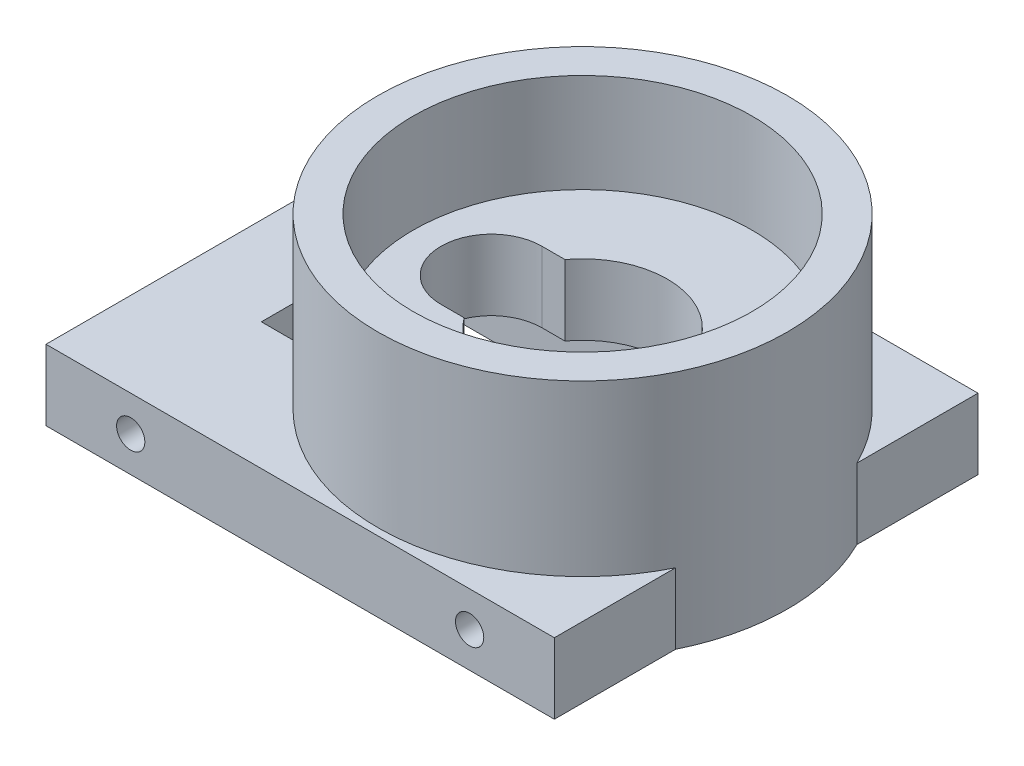
ISO-10303-21;
HEADER;
FILE_DESCRIPTION(('STEP AP214'),'2;1');
FILE_NAME('part.step','',(''),(''),'','','');
FILE_SCHEMA(('AUTOMOTIVE_DESIGN { 1 0 10303 214 1 1 1 1 }'));
ENDSEC;
DATA;
#1=APPLICATION_CONTEXT('core data for automotive mechanical design processes');
#2=APPLICATION_PROTOCOL_DEFINITION('international standard','automotive_design',2000,#1);
#3=PRODUCT_CONTEXT('',#1,'mechanical');
#4=PRODUCT('Part','Part','',(#3));
#5=PRODUCT_RELATED_PRODUCT_CATEGORY('part','',(#4));
#6=PRODUCT_DEFINITION_FORMATION('','',#4);
#7=PRODUCT_DEFINITION_CONTEXT('part definition',#1,'design');
#8=PRODUCT_DEFINITION('design','',#6,#7);
#9=PRODUCT_DEFINITION_SHAPE('','',#8);
#10=(LENGTH_UNIT() NAMED_UNIT(*) SI_UNIT(.MILLI.,.METRE.));
#11=(NAMED_UNIT(*) PLANE_ANGLE_UNIT() SI_UNIT($,.RADIAN.));
#12=(NAMED_UNIT(*) SI_UNIT($,.STERADIAN.) SOLID_ANGLE_UNIT());
#13=UNCERTAINTY_MEASURE_WITH_UNIT(LENGTH_MEASURE(1.E-05),#10,'distance_accuracy_value','');
#14=(GEOMETRIC_REPRESENTATION_CONTEXT(3) GLOBAL_UNCERTAINTY_ASSIGNED_CONTEXT((#13)) GLOBAL_UNIT_ASSIGNED_CONTEXT((#10,
#11,#12)) REPRESENTATION_CONTEXT('',''));
#15=CARTESIAN_POINT('',(0.,0.,0.));
#16=DIRECTION('',(0.,0.,1.));
#17=DIRECTION('',(1.,0.,0.));
#18=AXIS2_PLACEMENT_3D('',#15,#16,#17);
#19=CARTESIAN_POINT('',(0.,5.,0.));
#20=DIRECTION('',(0.,1.,0.));
#21=DIRECTION('',(0.,0.,1.));
#22=AXIS2_PLACEMENT_3D('',#19,#20,#21);
#23=PLANE('',#22);
#24=DIRECTION('',(-1.,0.,0.));
#25=VECTOR('',#24,1.);
#26=CARTESIAN_POINT('',(-11.75,5.,6.));
#27=LINE('',#26,#25);
#28=CARTESIAN_POINT('',(11.75,5.,6.));
#29=VERTEX_POINT('',#28);
#30=CARTESIAN_POINT('',(5.,5.,6.));
#31=VERTEX_POINT('',#30);
#32=EDGE_CURVE('E215',#29,#31,#27,.T.);
#33=ORIENTED_EDGE('',*,*,#32,.T.);
#34=CARTESIAN_POINT('',(5.,5.,0.));
#35=DIRECTION('',(0.,1.,0.));
#36=DIRECTION('',(0.,0.,1.));
#37=AXIS2_PLACEMENT_3D('',#34,#35,#36);
#38=CIRCLE('',#37,6.);
#39=CARTESIAN_POINT('',(5.,5.,-6.));
#40=VERTEX_POINT('',#39);
#41=EDGE_CURVE('E59',#40,#31,#38,.F.);
#42=ORIENTED_EDGE('',*,*,#41,.F.);
#43=DIRECTION('',(1.,0.,0.));
#44=VECTOR('',#43,1.);
#45=CARTESIAN_POINT('',(-11.75,5.,-6.));
#46=LINE('',#45,#44);
#47=CARTESIAN_POINT('',(11.75,5.,-6.));
#48=VERTEX_POINT('',#47);
#49=EDGE_CURVE('E229',#40,#48,#46,.T.);
#50=ORIENTED_EDGE('',*,*,#49,.T.);
#51=DIRECTION('',(0.,0.,1.));
#52=VECTOR('',#51,1.);
#53=CARTESIAN_POINT('',(11.75,5.,-6.));
#54=LINE('',#53,#52);
#55=EDGE_CURVE('E220',#48,#29,#54,.T.);
#56=ORIENTED_EDGE('',*,*,#55,.T.);
#57=EDGE_LOOP('',(#33,#42,#50,#56));
#58=FACE_BOUND('',#57,.T.);
#59=ADVANCED_FACE('F36',(#58),#23,.F.);
#60=CARTESIAN_POINT('',(0.,2.,0.));
#61=DIRECTION('',(0.,-1.,0.));
#62=DIRECTION('',(0.,0.,-1.));
#63=AXIS2_PLACEMENT_3D('',#60,#61,#62);
#64=PLANE('',#63);
#65=DIRECTION('',(0.,0.,-1.));
#66=VECTOR('',#65,1.);
#67=CARTESIAN_POINT('',(-11.75,2.,0.));
#68=LINE('',#67,#66);
#69=CARTESIAN_POINT('',(-11.75,2.,6.));
#70=VERTEX_POINT('',#69);
#71=CARTESIAN_POINT('',(-11.75,2.,-6.));
#72=VERTEX_POINT('',#71);
#73=EDGE_CURVE('E335',#70,#72,#68,.T.);
#74=ORIENTED_EDGE('',*,*,#73,.F.);
#75=DIRECTION('',(-1.,0.,0.));
#76=VECTOR('',#75,1.);
#77=CARTESIAN_POINT('',(-16.5,2.,6.));
#78=LINE('',#77,#76);
#79=CARTESIAN_POINT('',(-16.5,2.,6.));
#80=VERTEX_POINT('',#79);
#81=EDGE_CURVE('E256',#70,#80,#78,.T.);
#82=ORIENTED_EDGE('',*,*,#81,.T.);
#83=DIRECTION('',(0.,0.,-1.));
#84=VECTOR('',#83,1.);
#85=CARTESIAN_POINT('',(-16.5,2.,6.));
#86=LINE('',#85,#84);
#87=CARTESIAN_POINT('',(-16.5,2.,-6.));
#88=VERTEX_POINT('',#87);
#89=EDGE_CURVE('E261',#80,#88,#86,.T.);
#90=ORIENTED_EDGE('',*,*,#89,.T.);
#91=DIRECTION('',(1.,0.,0.));
#92=VECTOR('',#91,1.);
#93=CARTESIAN_POINT('',(-16.5,2.,-6.));
#94=LINE('',#93,#92);
#95=EDGE_CURVE('E265',#88,#72,#94,.T.);
#96=ORIENTED_EDGE('',*,*,#95,.T.);
#97=EDGE_LOOP('',(#74,#82,#90,#96));
#98=FACE_BOUND('',#97,.T.);
#99=CARTESIAN_POINT('',(-14.,2.,0.));
#100=DIRECTION('',(0.,-1.,0.));
#101=DIRECTION('',(0.,0.,-1.));
#102=AXIS2_PLACEMENT_3D('',#99,#100,#101);
#103=CIRCLE('',#102,1.);
#104=CARTESIAN_POINT('',(-14.,2.,-1.));
#105=VERTEX_POINT('',#104);
#106=EDGE_CURVE('E240',#105,#105,#103,.T.);
#107=ORIENTED_EDGE('',*,*,#106,.F.);
#108=EDGE_LOOP('',(#107));
#109=FACE_BOUND('',#108,.T.);
#110=ADVANCED_FACE('F380',(#98,#109),#64,.T.);
#111=CARTESIAN_POINT('',(18.,5.,-15.));
#112=DIRECTION('',(-1.,0.,0.));
#113=DIRECTION('',(0.,0.,1.));
#114=AXIS2_PLACEMENT_3D('',#111,#112,#113);
#115=PLANE('',#114);
#116=DIRECTION('',(0.,0.,-1.));
#117=VECTOR('',#116,1.);
#118=CARTESIAN_POINT('',(18.,5.,-15.));
#119=LINE('',#118,#117);
#120=CARTESIAN_POINT('',(18.,5.,-6.42261628933256));
#121=VERTEX_POINT('',#120);
#122=CARTESIAN_POINT('',(18.,5.,-15.));
#123=VERTEX_POINT('',#122);
#124=EDGE_CURVE('E307',#121,#123,#119,.T.);
#125=ORIENTED_EDGE('',*,*,#124,.F.);
#126=DIRECTION('',(0.,-1.,0.));
#127=VECTOR('',#126,1.);
#128=CARTESIAN_POINT('',(18.,17.,-6.42261628933256));
#129=LINE('',#128,#127);
#130=CARTESIAN_POINT('',(18.,0.,-6.42261628933256));
#131=VERTEX_POINT('',#130);
#132=EDGE_CURVE('E300',#121,#131,#129,.T.);
#133=ORIENTED_EDGE('',*,*,#132,.T.);
#134=DIRECTION('',(0.,0.,-1.));
#135=VECTOR('',#134,1.);
#136=CARTESIAN_POINT('',(18.,0.,-15.));
#137=LINE('',#136,#135);
#138=CARTESIAN_POINT('',(18.,0.,-15.));
#139=VERTEX_POINT('',#138);
#140=EDGE_CURVE('E302',#131,#139,#137,.T.);
#141=ORIENTED_EDGE('',*,*,#140,.T.);
#142=DIRECTION('',(0.,-1.,0.));
#143=VECTOR('',#142,1.);
#144=CARTESIAN_POINT('',(18.,5.,-15.));
#145=LINE('',#144,#143);
#146=EDGE_CURVE('E330',#123,#139,#145,.T.);
#147=ORIENTED_EDGE('',*,*,#146,.F.);
#148=EDGE_LOOP('',(#125,#133,#141,#147));
#149=FACE_BOUND('',#148,.T.);
#150=ADVANCED_FACE('F386',(#149),#115,.F.);
#151=CARTESIAN_POINT('',(18.,0.,15.));
#152=VERTEX_POINT('',#151);
#153=CARTESIAN_POINT('',(18.,0.,6.42261628933256));
#154=VERTEX_POINT('',#153);
#155=EDGE_CURVE('E314',#152,#154,#137,.T.);
#156=ORIENTED_EDGE('',*,*,#155,.T.);
#157=DIRECTION('',(0.,-1.,0.));
#158=VECTOR('',#157,1.);
#159=CARTESIAN_POINT('',(18.,17.,6.42261628933256));
#160=LINE('',#159,#158);
#161=CARTESIAN_POINT('',(18.,5.,6.42261628933256));
#162=VERTEX_POINT('',#161);
#163=EDGE_CURVE('E296',#154,#162,#160,.F.);
#164=ORIENTED_EDGE('',*,*,#163,.T.);
#165=CARTESIAN_POINT('',(18.,5.,15.));
#166=VERTEX_POINT('',#165);
#167=EDGE_CURVE('E303',#166,#162,#119,.T.);
#168=ORIENTED_EDGE('',*,*,#167,.F.);
#169=DIRECTION('',(0.,-1.,0.));
#170=VECTOR('',#169,1.);
#171=CARTESIAN_POINT('',(18.,5.,15.));
#172=LINE('',#171,#170);
#173=EDGE_CURVE('E313',#166,#152,#172,.T.);
#174=ORIENTED_EDGE('',*,*,#173,.T.);
#175=EDGE_LOOP('',(#156,#164,#168,#174));
#176=FACE_BOUND('',#175,.T.);
#177=ADVANCED_FACE('F38',(#176),#115,.F.);
#178=CARTESIAN_POINT('',(-18.,5.,-15.));
#179=DIRECTION('',(0.,0.,1.));
#180=DIRECTION('',(1.,0.,0.));
#181=AXIS2_PLACEMENT_3D('',#178,#179,#180);
#182=PLANE('',#181);
#183=CARTESIAN_POINT('',(12.,2.5,-15.));
#184=DIRECTION('',(0.,0.,-1.));
#185=DIRECTION('',(1.,0.,0.));
#186=AXIS2_PLACEMENT_3D('',#183,#184,#185);
#187=CIRCLE('',#186,1.);
#188=CARTESIAN_POINT('',(13.,2.5,-15.));
#189=VERTEX_POINT('',#188);
#190=EDGE_CURVE('E350',#189,#189,#187,.T.);
#191=ORIENTED_EDGE('',*,*,#190,.F.);
#192=EDGE_LOOP('',(#191));
#193=FACE_BOUND('',#192,.T.);
#194=CARTESIAN_POINT('',(-12.,2.5,-15.));
#195=DIRECTION('',(0.,0.,-1.));
#196=DIRECTION('',(-1.,0.,0.));
#197=AXIS2_PLACEMENT_3D('',#194,#195,#196);
#198=CIRCLE('',#197,1.);
#199=CARTESIAN_POINT('',(-13.,2.5,-15.));
#200=VERTEX_POINT('',#199);
#201=EDGE_CURVE('E344',#200,#200,#198,.T.);
#202=ORIENTED_EDGE('',*,*,#201,.F.);
#203=EDGE_LOOP('',(#202));
#204=FACE_BOUND('',#203,.T.);
#205=DIRECTION('',(-1.,0.,0.));
#206=VECTOR('',#205,1.);
#207=CARTESIAN_POINT('',(-18.,0.,-15.));
#208=LINE('',#207,#206);
#209=CARTESIAN_POINT('',(-18.,0.,-15.));
#210=VERTEX_POINT('',#209);
#211=EDGE_CURVE('E316',#139,#210,#208,.T.);
#212=ORIENTED_EDGE('',*,*,#211,.T.);
#213=DIRECTION('',(0.,-1.,0.));
#214=VECTOR('',#213,1.);
#215=CARTESIAN_POINT('',(-18.,5.,-15.));
#216=LINE('',#215,#214);
#217=CARTESIAN_POINT('',(-18.,5.,-15.));
#218=VERTEX_POINT('',#217);
#219=EDGE_CURVE('E327',#218,#210,#216,.T.);
#220=ORIENTED_EDGE('',*,*,#219,.F.);
#221=DIRECTION('',(-1.,0.,0.));
#222=VECTOR('',#221,1.);
#223=CARTESIAN_POINT('',(-18.,5.,-15.));
#224=LINE('',#223,#222);
#225=EDGE_CURVE('E306',#123,#218,#224,.T.);
#226=ORIENTED_EDGE('',*,*,#225,.F.);
#227=ORIENTED_EDGE('',*,*,#146,.T.);
#228=EDGE_LOOP('',(#212,#220,#226,#227));
#229=FACE_BOUND('',#228,.T.);
#230=ADVANCED_FACE('F455',(#193,#204,#229),#182,.F.);
#231=CARTESIAN_POINT('',(-18.,5.,-15.));
#232=DIRECTION('',(1.,0.,0.));
#233=DIRECTION('',(0.,0.,-1.));
#234=AXIS2_PLACEMENT_3D('',#231,#232,#233);
#235=PLANE('',#234);
#236=DIRECTION('',(0.,0.,1.));
#237=VECTOR('',#236,1.);
#238=CARTESIAN_POINT('',(-18.,0.,-15.));
#239=LINE('',#238,#237);
#240=CARTESIAN_POINT('',(-18.,0.,15.));
#241=VERTEX_POINT('',#240);
#242=EDGE_CURVE('E318',#210,#241,#239,.T.);
#243=ORIENTED_EDGE('',*,*,#242,.T.);
#244=DIRECTION('',(0.,-1.,0.));
#245=VECTOR('',#244,1.);
#246=CARTESIAN_POINT('',(-18.,5.,15.));
#247=LINE('',#246,#245);
#248=CARTESIAN_POINT('',(-18.,5.,15.));
#249=VERTEX_POINT('',#248);
#250=EDGE_CURVE('E324',#249,#241,#247,.T.);
#251=ORIENTED_EDGE('',*,*,#250,.F.);
#252=DIRECTION('',(0.,0.,1.));
#253=VECTOR('',#252,1.);
#254=CARTESIAN_POINT('',(-18.,5.,-15.));
#255=LINE('',#254,#253);
#256=EDGE_CURVE('E309',#218,#249,#255,.T.);
#257=ORIENTED_EDGE('',*,*,#256,.F.);
#258=ORIENTED_EDGE('',*,*,#219,.T.);
#259=EDGE_LOOP('',(#243,#251,#257,#258));
#260=FACE_BOUND('',#259,.T.);
#261=ADVANCED_FACE('F452',(#260),#235,.F.);
#262=CARTESIAN_POINT('',(-18.,5.,15.));
#263=DIRECTION('',(0.,0.,-1.));
#264=DIRECTION('',(-1.,0.,0.));
#265=AXIS2_PLACEMENT_3D('',#262,#263,#264);
#266=PLANE('',#265);
#267=CARTESIAN_POINT('',(12.,2.5,15.));
#268=DIRECTION('',(0.,0.,-1.));
#269=DIRECTION('',(1.,0.,0.));
#270=AXIS2_PLACEMENT_3D('',#267,#268,#269);
#271=CIRCLE('',#270,1.);
#272=CARTESIAN_POINT('',(13.,2.5,15.));
#273=VERTEX_POINT('',#272);
#274=EDGE_CURVE('E362',#273,#273,#271,.T.);
#275=ORIENTED_EDGE('',*,*,#274,.T.);
#276=EDGE_LOOP('',(#275));
#277=FACE_BOUND('',#276,.T.);
#278=CARTESIAN_POINT('',(-12.,2.5,15.));
#279=DIRECTION('',(0.,0.,-1.));
#280=DIRECTION('',(-1.,0.,0.));
#281=AXIS2_PLACEMENT_3D('',#278,#279,#280);
#282=CIRCLE('',#281,1.);
#283=CARTESIAN_POINT('',(-13.,2.5,15.));
#284=VERTEX_POINT('',#283);
#285=EDGE_CURVE('E356',#284,#284,#282,.T.);
#286=ORIENTED_EDGE('',*,*,#285,.T.);
#287=EDGE_LOOP('',(#286));
#288=FACE_BOUND('',#287,.T.);
#289=DIRECTION('',(1.,0.,0.));
#290=VECTOR('',#289,1.);
#291=CARTESIAN_POINT('',(-18.,0.,15.));
#292=LINE('',#291,#290);
#293=EDGE_CURVE('E320',#241,#152,#292,.T.);
#294=ORIENTED_EDGE('',*,*,#293,.T.);
#295=ORIENTED_EDGE('',*,*,#173,.F.);
#296=DIRECTION('',(1.,0.,0.));
#297=VECTOR('',#296,1.);
#298=CARTESIAN_POINT('',(-18.,5.,15.));
#299=LINE('',#298,#297);
#300=EDGE_CURVE('E311',#249,#166,#299,.T.);
#301=ORIENTED_EDGE('',*,*,#300,.F.);
#302=ORIENTED_EDGE('',*,*,#250,.T.);
#303=EDGE_LOOP('',(#294,#295,#301,#302));
#304=FACE_BOUND('',#303,.T.);
#305=ADVANCED_FACE('F445',(#277,#288,#304),#266,.F.);
#306=CARTESIAN_POINT('',(0.,5.,0.));
#307=DIRECTION('',(0.,1.,0.));
#308=DIRECTION('',(0.,0.,1.));
#309=AXIS2_PLACEMENT_3D('',#306,#307,#308);
#310=PLANE('',#309);
#311=CARTESIAN_POINT('',(-8.20037878244408,5.,6.));
#312=VERTEX_POINT('',#311);
#313=CARTESIAN_POINT('',(-11.75,5.,6.));
#314=VERTEX_POINT('',#313);
#315=EDGE_CURVE('E212',#312,#314,#27,.T.);
#316=ORIENTED_EDGE('',*,*,#315,.T.);
#317=DIRECTION('',(0.,0.,-1.));
#318=VECTOR('',#317,1.);
#319=CARTESIAN_POINT('',(-11.75,5.,-6.));
#320=LINE('',#319,#318);
#321=CARTESIAN_POINT('',(-11.75,5.,-6.));
#322=VERTEX_POINT('',#321);
#323=EDGE_CURVE('E230',#314,#322,#320,.T.);
#324=ORIENTED_EDGE('',*,*,#323,.T.);
#325=CARTESIAN_POINT('',(-8.20037878244408,5.,-6.));
#326=VERTEX_POINT('',#325);
#327=EDGE_CURVE('E225',#322,#326,#46,.T.);
#328=ORIENTED_EDGE('',*,*,#327,.T.);
#329=CARTESIAN_POINT('',(5.,5.,0.));
#330=DIRECTION('',(0.,1.,0.));
#331=DIRECTION('',(0.,0.,1.));
#332=AXIS2_PLACEMENT_3D('',#329,#330,#331);
#333=CIRCLE('',#332,14.5);
#334=EDGE_CURVE('E293',#121,#326,#333,.T.);
#335=ORIENTED_EDGE('',*,*,#334,.F.);
#336=ORIENTED_EDGE('',*,*,#124,.T.);
#337=ORIENTED_EDGE('',*,*,#225,.T.);
#338=ORIENTED_EDGE('',*,*,#256,.T.);
#339=ORIENTED_EDGE('',*,*,#300,.T.);
#340=ORIENTED_EDGE('',*,*,#167,.T.);
#341=EDGE_CURVE('E290',#312,#162,#333,.T.);
#342=ORIENTED_EDGE('',*,*,#341,.F.);
#343=EDGE_LOOP('',(#316,#324,#328,#335,#336,#337,#338,#339,#340,#342));
#344=FACE_BOUND('',#343,.T.);
#345=CARTESIAN_POINT('',(-14.,5.,0.));
#346=DIRECTION('',(0.,-1.,0.));
#347=DIRECTION('',(0.,0.,-1.));
#348=AXIS2_PLACEMENT_3D('',#345,#346,#347);
#349=CIRCLE('',#348,1.);
#350=CARTESIAN_POINT('',(-14.,5.,-1.));
#351=VERTEX_POINT('',#350);
#352=EDGE_CURVE('E241',#351,#351,#349,.T.);
#353=ORIENTED_EDGE('',*,*,#352,.T.);
#354=EDGE_LOOP('',(#353));
#355=FACE_BOUND('',#354,.T.);
#356=ADVANCED_FACE('F442',(#344,#355),#310,.T.);
#357=CARTESIAN_POINT('',(0.,0.,0.));
#358=DIRECTION('',(0.,1.,0.));
#359=DIRECTION('',(0.,0.,1.));
#360=AXIS2_PLACEMENT_3D('',#357,#358,#359);
#361=PLANE('',#360);
#362=DIRECTION('',(-1.,0.,0.));
#363=VECTOR('',#362,1.);
#364=CARTESIAN_POINT('',(-16.5,0.,6.));
#365=LINE('',#364,#363);
#366=CARTESIAN_POINT('',(16.5,0.,6.));
#367=VERTEX_POINT('',#366);
#368=CARTESIAN_POINT('',(-16.5,0.,6.));
#369=VERTEX_POINT('',#368);
#370=EDGE_CURVE('E270',#367,#369,#365,.T.);
#371=ORIENTED_EDGE('',*,*,#370,.F.);
#372=DIRECTION('',(0.,0.,1.));
#373=VECTOR('',#372,1.);
#374=CARTESIAN_POINT('',(16.5,0.,6.));
#375=LINE('',#374,#373);
#376=CARTESIAN_POINT('',(16.5,0.,-6.));
#377=VERTEX_POINT('',#376);
#378=EDGE_CURVE('E250',#377,#367,#375,.T.);
#379=ORIENTED_EDGE('',*,*,#378,.F.);
#380=DIRECTION('',(1.,0.,0.));
#381=VECTOR('',#380,1.);
#382=CARTESIAN_POINT('',(-16.5,0.,-6.));
#383=LINE('',#382,#381);
#384=CARTESIAN_POINT('',(-16.5,0.,-6.));
#385=VERTEX_POINT('',#384);
#386=EDGE_CURVE('E257',#385,#377,#383,.T.);
#387=ORIENTED_EDGE('',*,*,#386,.F.);
#388=DIRECTION('',(0.,0.,-1.));
#389=VECTOR('',#388,1.);
#390=CARTESIAN_POINT('',(-16.5,0.,6.));
#391=LINE('',#390,#389);
#392=EDGE_CURVE('E272',#369,#385,#391,.T.);
#393=ORIENTED_EDGE('',*,*,#392,.F.);
#394=EDGE_LOOP('',(#371,#379,#387,#393));
#395=FACE_BOUND('',#394,.T.);
#396=ORIENTED_EDGE('',*,*,#140,.F.);
#397=CARTESIAN_POINT('',(5.,0.,0.));
#398=DIRECTION('',(0.,-1.,0.));
#399=DIRECTION('',(0.,0.,-1.));
#400=AXIS2_PLACEMENT_3D('',#397,#398,#399);
#401=CIRCLE('',#400,14.5);
#402=EDGE_CURVE('E279',#131,#154,#401,.T.);
#403=ORIENTED_EDGE('',*,*,#402,.T.);
#404=ORIENTED_EDGE('',*,*,#155,.F.);
#405=ORIENTED_EDGE('',*,*,#293,.F.);
#406=ORIENTED_EDGE('',*,*,#242,.F.);
#407=ORIENTED_EDGE('',*,*,#211,.F.);
#408=EDGE_LOOP('',(#396,#403,#404,#405,#406,#407));
#409=FACE_BOUND('',#408,.T.);
#410=ADVANCED_FACE('F440',(#395,#409),#361,.F.);
#411=CARTESIAN_POINT('',(5.,17.,0.));
#412=DIRECTION('',(0.,-1.,0.));
#413=DIRECTION('',(0.,0.,-1.));
#414=AXIS2_PLACEMENT_3D('',#411,#412,#413);
#415=CYLINDRICAL_SURFACE('',#414,14.5);
#416=CARTESIAN_POINT('',(5.,17.,0.));
#417=DIRECTION('',(0.,-1.,0.));
#418=DIRECTION('',(0.,0.,-1.));
#419=AXIS2_PLACEMENT_3D('',#416,#417,#418);
#420=CIRCLE('',#419,14.5);
#421=CARTESIAN_POINT('',(5.,17.,-14.5));
#422=VERTEX_POINT('',#421);
#423=EDGE_CURVE('E287',#422,#422,#420,.T.);
#424=ORIENTED_EDGE('',*,*,#423,.T.);
#425=EDGE_LOOP('',(#424));
#426=FACE_BOUND('',#425,.T.);
#427=ORIENTED_EDGE('',*,*,#132,.F.);
#428=ORIENTED_EDGE('',*,*,#334,.T.);
#429=EDGE_CURVE('E297',#326,#312,#333,.T.);
#430=ORIENTED_EDGE('',*,*,#429,.T.);
#431=ORIENTED_EDGE('',*,*,#341,.T.);
#432=ORIENTED_EDGE('',*,*,#163,.F.);
#433=ORIENTED_EDGE('',*,*,#402,.F.);
#434=EDGE_LOOP('',(#427,#428,#430,#431,#432,#433));
#435=FACE_BOUND('',#434,.T.);
#436=ADVANCED_FACE('F436',(#426,#435),#415,.T.);
#437=CARTESIAN_POINT('',(5.,17.,0.));
#438=DIRECTION('',(0.,-1.,0.));
#439=DIRECTION('',(0.,0.,-1.));
#440=AXIS2_PLACEMENT_3D('',#437,#438,#439);
#441=PLANE('',#440);
#442=CARTESIAN_POINT('',(5.,17.,0.));
#443=DIRECTION('',(0.,1.,0.));
#444=DIRECTION('',(0.,0.,1.));
#445=AXIS2_PLACEMENT_3D('',#442,#443,#444);
#446=CIRCLE('',#445,12.);
#447=CARTESIAN_POINT('',(5.,17.,12.));
#448=VERTEX_POINT('',#447);
#449=EDGE_CURVE('E207',#448,#448,#446,.T.);
#450=ORIENTED_EDGE('',*,*,#449,.F.);
#451=EDGE_LOOP('',(#450));
#452=FACE_BOUND('',#451,.T.);
#453=ORIENTED_EDGE('',*,*,#423,.F.);
#454=EDGE_LOOP('',(#453));
#455=FACE_BOUND('',#454,.T.);
#456=ADVANCED_FACE('F432',(#452,#455),#441,.F.);
#457=CARTESIAN_POINT('',(16.5,2.,6.));
#458=DIRECTION('',(1.,0.,0.));
#459=DIRECTION('',(0.,0.,-1.));
#460=AXIS2_PLACEMENT_3D('',#457,#458,#459);
#461=PLANE('',#460);
#462=ORIENTED_EDGE('',*,*,#378,.T.);
#463=DIRECTION('',(0.,-1.,0.));
#464=VECTOR('',#463,1.);
#465=CARTESIAN_POINT('',(16.5,2.,6.));
#466=LINE('',#465,#464);
#467=CARTESIAN_POINT('',(16.5,2.,6.));
#468=VERTEX_POINT('',#467);
#469=EDGE_CURVE('E268',#468,#367,#466,.T.);
#470=ORIENTED_EDGE('',*,*,#469,.F.);
#471=DIRECTION('',(0.,0.,1.));
#472=VECTOR('',#471,1.);
#473=CARTESIAN_POINT('',(16.5,2.,6.));
#474=LINE('',#473,#472);
#475=CARTESIAN_POINT('',(16.5,2.,-6.));
#476=VERTEX_POINT('',#475);
#477=EDGE_CURVE('E253',#476,#468,#474,.T.);
#478=ORIENTED_EDGE('',*,*,#477,.F.);
#479=DIRECTION('',(0.,-1.,0.));
#480=VECTOR('',#479,1.);
#481=CARTESIAN_POINT('',(16.5,2.,-6.));
#482=LINE('',#481,#480);
#483=EDGE_CURVE('E276',#476,#377,#482,.T.);
#484=ORIENTED_EDGE('',*,*,#483,.T.);
#485=EDGE_LOOP('',(#462,#470,#478,#484));
#486=FACE_BOUND('',#485,.T.);
#487=ADVANCED_FACE('F422',(#486),#461,.F.);
#488=CARTESIAN_POINT('',(-16.5,2.,-6.));
#489=DIRECTION('',(0.,0.,-1.));
#490=DIRECTION('',(-1.,0.,0.));
#491=AXIS2_PLACEMENT_3D('',#488,#489,#490);
#492=PLANE('',#491);
#493=CARTESIAN_POINT('',(11.75,2.,-6.));
#494=VERTEX_POINT('',#493);
#495=EDGE_CURVE('E264',#494,#476,#94,.T.);
#496=ORIENTED_EDGE('',*,*,#495,.F.);
#497=DIRECTION('',(0.,-1.,0.));
#498=VECTOR('',#497,1.);
#499=CARTESIAN_POINT('',(11.75,31.3865496039175,-6.));
#500=LINE('',#499,#498);
#501=EDGE_CURVE('E224',#48,#494,#500,.T.);
#502=ORIENTED_EDGE('',*,*,#501,.F.);
#503=ORIENTED_EDGE('',*,*,#49,.F.);
#504=EDGE_CURVE('E228',#326,#40,#46,.T.);
#505=ORIENTED_EDGE('',*,*,#504,.F.);
#506=ORIENTED_EDGE('',*,*,#327,.F.);
#507=DIRECTION('',(0.,-1.,0.));
#508=VECTOR('',#507,1.);
#509=CARTESIAN_POINT('',(-11.75,31.3865496039175,-6.));
#510=LINE('',#509,#508);
#511=EDGE_CURVE('E233',#322,#72,#510,.T.);
#512=ORIENTED_EDGE('',*,*,#511,.T.);
#513=ORIENTED_EDGE('',*,*,#95,.F.);
#514=DIRECTION('',(0.,-1.,0.));
#515=VECTOR('',#514,1.);
#516=CARTESIAN_POINT('',(-16.5,2.,-6.));
#517=LINE('',#516,#515);
#518=EDGE_CURVE('E280',#88,#385,#517,.T.);
#519=ORIENTED_EDGE('',*,*,#518,.T.);
#520=ORIENTED_EDGE('',*,*,#386,.T.);
#521=ORIENTED_EDGE('',*,*,#483,.F.);
#522=EDGE_LOOP('',(#496,#502,#503,#505,#506,#512,#513,#519,#520,#521));
#523=FACE_BOUND('',#522,.T.);
#524=ADVANCED_FACE('F418',(#523),#492,.F.);
#525=CARTESIAN_POINT('',(-16.5,2.,6.));
#526=DIRECTION('',(-1.,0.,0.));
#527=DIRECTION('',(0.,0.,1.));
#528=AXIS2_PLACEMENT_3D('',#525,#526,#527);
#529=PLANE('',#528);
#530=ORIENTED_EDGE('',*,*,#392,.T.);
#531=ORIENTED_EDGE('',*,*,#518,.F.);
#532=ORIENTED_EDGE('',*,*,#89,.F.);
#533=DIRECTION('',(0.,-1.,0.));
#534=VECTOR('',#533,1.);
#535=CARTESIAN_POINT('',(-16.5,2.,6.));
#536=LINE('',#535,#534);
#537=EDGE_CURVE('E282',#80,#369,#536,.T.);
#538=ORIENTED_EDGE('',*,*,#537,.T.);
#539=EDGE_LOOP('',(#530,#531,#532,#538));
#540=FACE_BOUND('',#539,.T.);
#541=ADVANCED_FACE('F421',(#540),#529,.F.);
#542=CARTESIAN_POINT('',(-16.5,2.,6.));
#543=DIRECTION('',(0.,0.,1.));
#544=DIRECTION('',(1.,0.,0.));
#545=AXIS2_PLACEMENT_3D('',#542,#543,#544);
#546=PLANE('',#545);
#547=ORIENTED_EDGE('',*,*,#370,.T.);
#548=ORIENTED_EDGE('',*,*,#537,.F.);
#549=ORIENTED_EDGE('',*,*,#81,.F.);
#550=DIRECTION('',(0.,-1.,0.));
#551=VECTOR('',#550,1.);
#552=CARTESIAN_POINT('',(-11.75,31.3865496039175,6.));
#553=LINE('',#552,#551);
#554=EDGE_CURVE('E218',#314,#70,#553,.T.);
#555=ORIENTED_EDGE('',*,*,#554,.F.);
#556=ORIENTED_EDGE('',*,*,#315,.F.);
#557=EDGE_CURVE('E219',#31,#312,#27,.T.);
#558=ORIENTED_EDGE('',*,*,#557,.F.);
#559=ORIENTED_EDGE('',*,*,#32,.F.);
#560=DIRECTION('',(0.,-1.,0.));
#561=VECTOR('',#560,1.);
#562=CARTESIAN_POINT('',(11.75,31.3865496039175,6.));
#563=LINE('',#562,#561);
#564=CARTESIAN_POINT('',(11.75,2.,6.));
#565=VERTEX_POINT('',#564);
#566=EDGE_CURVE('E223',#29,#565,#563,.T.);
#567=ORIENTED_EDGE('',*,*,#566,.T.);
#568=EDGE_CURVE('E258',#468,#565,#78,.T.);
#569=ORIENTED_EDGE('',*,*,#568,.F.);
#570=ORIENTED_EDGE('',*,*,#469,.T.);
#571=EDGE_LOOP('',(#547,#548,#549,#555,#556,#558,#559,#567,#569,#570));
#572=FACE_BOUND('',#571,.T.);
#573=ADVANCED_FACE('F416',(#572),#546,.F.);
#574=DIRECTION('',(0.,0.,1.));
#575=VECTOR('',#574,1.);
#576=CARTESIAN_POINT('',(11.75,2.,0.));
#577=LINE('',#576,#575);
#578=EDGE_CURVE('E333',#494,#565,#577,.T.);
#579=ORIENTED_EDGE('',*,*,#578,.F.);
#580=ORIENTED_EDGE('',*,*,#495,.T.);
#581=ORIENTED_EDGE('',*,*,#477,.T.);
#582=ORIENTED_EDGE('',*,*,#568,.T.);
#583=EDGE_LOOP('',(#579,#580,#581,#582));
#584=FACE_BOUND('',#583,.T.);
#585=CARTESIAN_POINT('',(14.,2.,0.));
#586=DIRECTION('',(0.,-1.,0.));
#587=DIRECTION('',(0.,0.,-1.));
#588=AXIS2_PLACEMENT_3D('',#585,#586,#587);
#589=CIRCLE('',#588,1.);
#590=CARTESIAN_POINT('',(14.,2.,-1.));
#591=VERTEX_POINT('',#590);
#592=EDGE_CURVE('E244',#591,#591,#589,.T.);
#593=ORIENTED_EDGE('',*,*,#592,.F.);
#594=EDGE_LOOP('',(#593));
#595=FACE_BOUND('',#594,.T.);
#596=ADVANCED_FACE('F389',(#584,#595),#64,.T.);
#597=CARTESIAN_POINT('',(14.,5.,0.));
#598=DIRECTION('',(0.,-1.,0.));
#599=DIRECTION('',(0.,0.,-1.));
#600=AXIS2_PLACEMENT_3D('',#597,#598,#599);
#601=CYLINDRICAL_SURFACE('',#600,1.);
#602=CARTESIAN_POINT('',(14.,5.,0.));
#603=DIRECTION('',(0.,-1.,0.));
#604=DIRECTION('',(0.,0.,-1.));
#605=AXIS2_PLACEMENT_3D('',#602,#603,#604);
#606=CIRCLE('',#605,1.);
#607=CARTESIAN_POINT('',(14.,5.,-1.));
#608=VERTEX_POINT('',#607);
#609=EDGE_CURVE('E247',#608,#608,#606,.T.);
#610=ORIENTED_EDGE('',*,*,#609,.F.);
#611=EDGE_LOOP('',(#610));
#612=FACE_BOUND('',#611,.T.);
#613=ORIENTED_EDGE('',*,*,#592,.T.);
#614=EDGE_LOOP('',(#613));
#615=FACE_BOUND('',#614,.T.);
#616=ADVANCED_FACE('F406',(#612,#615),#601,.F.);
#617=CARTESIAN_POINT('',(14.,5.,0.));
#618=DIRECTION('',(0.,-1.,0.));
#619=DIRECTION('',(0.,0.,-1.));
#620=AXIS2_PLACEMENT_3D('',#617,#618,#619);
#621=PLANE('',#620);
#622=ORIENTED_EDGE('',*,*,#609,.T.);
#623=EDGE_LOOP('',(#622));
#624=FACE_BOUND('',#623,.T.);
#625=ADVANCED_FACE('F401',(#624),#621,.T.);
#626=CARTESIAN_POINT('',(-14.,5.,0.));
#627=DIRECTION('',(0.,-1.,0.));
#628=DIRECTION('',(0.,0.,-1.));
#629=AXIS2_PLACEMENT_3D('',#626,#627,#628);
#630=CYLINDRICAL_SURFACE('',#629,1.);
#631=ORIENTED_EDGE('',*,*,#352,.F.);
#632=EDGE_LOOP('',(#631));
#633=FACE_BOUND('',#632,.T.);
#634=ORIENTED_EDGE('',*,*,#106,.T.);
#635=EDGE_LOOP('',(#634));
#636=FACE_BOUND('',#635,.T.);
#637=ADVANCED_FACE('F394',(#633,#636),#630,.F.);
#638=CARTESIAN_POINT('',(0.178323527786514,5.,-3.57091528845238));
#639=VERTEX_POINT('',#638);
#640=EDGE_CURVE('E208',#639,#40,#38,.F.);
#641=ORIENTED_EDGE('',*,*,#640,.F.);
#642=DIRECTION('',(1.,0.,0.));
#643=VECTOR('',#642,1.);
#644=CARTESIAN_POINT('',(-1.4554925367527,5.,-3.57091528845238));
#645=LINE('',#644,#643);
#646=CARTESIAN_POINT('',(-1.4554925367527,5.,-3.57091528845238));
#647=VERTEX_POINT('',#646);
#648=EDGE_CURVE('E200',#647,#639,#645,.T.);
#649=ORIENTED_EDGE('',*,*,#648,.F.);
#650=CARTESIAN_POINT('',(-1.4554925367527,5.,0.));
#651=DIRECTION('',(0.,1.,0.));
#652=DIRECTION('',(0.,0.,1.));
#653=AXIS2_PLACEMENT_3D('',#650,#651,#652);
#654=CIRCLE('',#653,3.57091528845238);
#655=CARTESIAN_POINT('',(-1.4554925367527,5.,3.57091528845238));
#656=VERTEX_POINT('',#655);
#657=EDGE_CURVE('E203',#656,#647,#654,.F.);
#658=ORIENTED_EDGE('',*,*,#657,.F.);
#659=DIRECTION('',(-1.,0.,0.));
#660=VECTOR('',#659,1.);
#661=CARTESIAN_POINT('',(2.11542275169968,5.,3.57091528845238));
#662=LINE('',#661,#660);
#663=CARTESIAN_POINT('',(0.178323527786514,5.,3.57091528845238));
#664=VERTEX_POINT('',#663);
#665=EDGE_CURVE('E176',#664,#656,#662,.T.);
#666=ORIENTED_EDGE('',*,*,#665,.F.);
#667=EDGE_CURVE('E205',#31,#664,#38,.F.);
#668=ORIENTED_EDGE('',*,*,#667,.F.);
#669=ORIENTED_EDGE('',*,*,#557,.T.);
#670=ORIENTED_EDGE('',*,*,#429,.F.);
#671=ORIENTED_EDGE('',*,*,#504,.T.);
#672=EDGE_LOOP('',(#641,#649,#658,#666,#668,#669,#670,#671));
#673=FACE_BOUND('',#672,.T.);
#674=ADVANCED_FACE('F339',(#673),#23,.F.);
#675=CARTESIAN_POINT('',(-11.75,31.3865496039175,-6.));
#676=DIRECTION('',(-1.,0.,0.));
#677=DIRECTION('',(0.,0.,1.));
#678=AXIS2_PLACEMENT_3D('',#675,#676,#677);
#679=PLANE('',#678);
#680=ORIENTED_EDGE('',*,*,#73,.T.);
#681=ORIENTED_EDGE('',*,*,#511,.F.);
#682=ORIENTED_EDGE('',*,*,#323,.F.);
#683=ORIENTED_EDGE('',*,*,#554,.T.);
#684=EDGE_LOOP('',(#680,#681,#682,#683));
#685=FACE_BOUND('',#684,.T.);
#686=ADVANCED_FACE('F393',(#685),#679,.F.);
#687=CARTESIAN_POINT('',(11.75,31.3865496039175,-6.));
#688=DIRECTION('',(1.,0.,0.));
#689=DIRECTION('',(0.,0.,-1.));
#690=AXIS2_PLACEMENT_3D('',#687,#688,#689);
#691=PLANE('',#690);
#692=ORIENTED_EDGE('',*,*,#578,.T.);
#693=ORIENTED_EDGE('',*,*,#566,.F.);
#694=ORIENTED_EDGE('',*,*,#55,.F.);
#695=ORIENTED_EDGE('',*,*,#501,.T.);
#696=EDGE_LOOP('',(#692,#693,#694,#695));
#697=FACE_BOUND('',#696,.T.);
#698=ADVANCED_FACE('F399',(#697),#691,.F.);
#699=CARTESIAN_POINT('',(5.,10.,0.));
#700=DIRECTION('',(0.,1.,0.));
#701=DIRECTION('',(0.,0.,1.));
#702=AXIS2_PLACEMENT_3D('',#699,#700,#701);
#703=CYLINDRICAL_SURFACE('',#702,12.);
#704=CARTESIAN_POINT('',(5.,10.,0.));
#705=DIRECTION('',(0.,1.,0.));
#706=DIRECTION('',(0.,0.,1.));
#707=AXIS2_PLACEMENT_3D('',#704,#705,#706);
#708=CIRCLE('',#707,12.);
#709=CARTESIAN_POINT('',(5.,10.,12.));
#710=VERTEX_POINT('',#709);
#711=EDGE_CURVE('E209',#710,#710,#708,.T.);
#712=ORIENTED_EDGE('',*,*,#711,.F.);
#713=EDGE_LOOP('',(#712));
#714=FACE_BOUND('',#713,.T.);
#715=ORIENTED_EDGE('',*,*,#449,.T.);
#716=EDGE_LOOP('',(#715));
#717=FACE_BOUND('',#716,.T.);
#718=ADVANCED_FACE('F536',(#714,#717),#703,.F.);
#719=CARTESIAN_POINT('',(5.,10.,0.));
#720=DIRECTION('',(0.,1.,0.));
#721=DIRECTION('',(0.,0.,1.));
#722=AXIS2_PLACEMENT_3D('',#719,#720,#721);
#723=PLANE('',#722);
#724=DIRECTION('',(-1.,0.,0.));
#725=VECTOR('',#724,1.);
#726=CARTESIAN_POINT('',(-1.4554925367527,10.,-3.57091528845238));
#727=LINE('',#726,#725);
#728=CARTESIAN_POINT('',(0.178323527786514,10.,-3.57091528845238));
#729=VERTEX_POINT('',#728);
#730=CARTESIAN_POINT('',(-1.4554925367527,10.,-3.57091528845238));
#731=VERTEX_POINT('',#730);
#732=EDGE_CURVE('E180',#729,#731,#727,.T.);
#733=ORIENTED_EDGE('',*,*,#732,.F.);
#734=CARTESIAN_POINT('',(5.,10.,0.));
#735=DIRECTION('',(0.,1.,0.));
#736=DIRECTION('',(0.,0.,1.));
#737=AXIS2_PLACEMENT_3D('',#734,#735,#736);
#738=CIRCLE('',#737,6.);
#739=CARTESIAN_POINT('',(0.178323527786515,10.,3.57091528845238));
#740=VERTEX_POINT('',#739);
#741=EDGE_CURVE('E195',#740,#729,#738,.T.);
#742=ORIENTED_EDGE('',*,*,#741,.F.);
#743=DIRECTION('',(1.,0.,0.));
#744=VECTOR('',#743,1.);
#745=CARTESIAN_POINT('',(2.11542275169968,10.,3.57091528845238));
#746=LINE('',#745,#744);
#747=CARTESIAN_POINT('',(-1.4554925367527,10.,3.57091528845238));
#748=VERTEX_POINT('',#747);
#749=EDGE_CURVE('E51',#748,#740,#746,.T.);
#750=ORIENTED_EDGE('',*,*,#749,.F.);
#751=CARTESIAN_POINT('',(-1.4554925367527,10.,0.));
#752=DIRECTION('',(0.,1.,0.));
#753=DIRECTION('',(0.,0.,1.));
#754=AXIS2_PLACEMENT_3D('',#751,#752,#753);
#755=CIRCLE('',#754,3.57091528845238);
#756=EDGE_CURVE('E184',#731,#748,#755,.T.);
#757=ORIENTED_EDGE('',*,*,#756,.F.);
#758=EDGE_LOOP('',(#733,#742,#750,#757));
#759=FACE_BOUND('',#758,.T.);
#760=ORIENTED_EDGE('',*,*,#711,.T.);
#761=EDGE_LOOP('',(#760));
#762=FACE_BOUND('',#761,.T.);
#763=ADVANCED_FACE('F192',(#759,#762),#723,.T.);
#764=CARTESIAN_POINT('',(5.,-11.9705627484771,0.));
#765=DIRECTION('',(0.,1.,0.));
#766=DIRECTION('',(0.,0.,1.));
#767=AXIS2_PLACEMENT_3D('',#764,#765,#766);
#768=CYLINDRICAL_SURFACE('',#767,6.);
#769=ORIENTED_EDGE('',*,*,#741,.T.);
#770=DIRECTION('',(0.,1.,0.));
#771=VECTOR('',#770,1.);
#772=CARTESIAN_POINT('',(0.178323527786514,-11.9705627484771,-3.57091528845238));
#773=LINE('',#772,#771);
#774=EDGE_CURVE('E11',#729,#639,#773,.F.);
#775=ORIENTED_EDGE('',*,*,#774,.T.);
#776=ORIENTED_EDGE('',*,*,#640,.T.);
#777=ORIENTED_EDGE('',*,*,#41,.T.);
#778=ORIENTED_EDGE('',*,*,#667,.T.);
#779=DIRECTION('',(0.,1.,0.));
#780=VECTOR('',#779,1.);
#781=CARTESIAN_POINT('',(0.178323527786514,-11.9705627484771,3.57091528845238));
#782=LINE('',#781,#780);
#783=EDGE_CURVE('E44',#664,#740,#782,.T.);
#784=ORIENTED_EDGE('',*,*,#783,.T.);
#785=EDGE_LOOP('',(#769,#775,#776,#777,#778,#784));
#786=FACE_BOUND('',#785,.T.);
#787=ADVANCED_FACE('F336',(#786),#768,.F.);
#788=CARTESIAN_POINT('',(-1.4554925367527,-5.10007366202957,-3.57091528845238));
#789=DIRECTION('',(0.,0.,-1.));
#790=DIRECTION('',(-1.,0.,0.));
#791=AXIS2_PLACEMENT_3D('',#788,#789,#790);
#792=PLANE('',#791);
#793=ORIENTED_EDGE('',*,*,#732,.T.);
#794=DIRECTION('',(0.,1.,0.));
#795=VECTOR('',#794,1.);
#796=CARTESIAN_POINT('',(-1.4554925367527,-5.10007366202957,-3.57091528845238));
#797=LINE('',#796,#795);
#798=EDGE_CURVE('E179',#647,#731,#797,.T.);
#799=ORIENTED_EDGE('',*,*,#798,.F.);
#800=ORIENTED_EDGE('',*,*,#648,.T.);
#801=ORIENTED_EDGE('',*,*,#774,.F.);
#802=EDGE_LOOP('',(#793,#799,#800,#801));
#803=FACE_BOUND('',#802,.T.);
#804=ADVANCED_FACE('F519',(#803),#792,.F.);
#805=CARTESIAN_POINT('',(2.11542275169968,-5.10007366202957,3.57091528845238));
#806=DIRECTION('',(0.,0.,1.));
#807=DIRECTION('',(1.,0.,0.));
#808=AXIS2_PLACEMENT_3D('',#805,#806,#807);
#809=PLANE('',#808);
#810=ORIENTED_EDGE('',*,*,#665,.T.);
#811=DIRECTION('',(0.,1.,0.));
#812=VECTOR('',#811,1.);
#813=CARTESIAN_POINT('',(-1.4554925367527,-5.10007366202957,3.57091528845238));
#814=LINE('',#813,#812);
#815=EDGE_CURVE('E172',#656,#748,#814,.T.);
#816=ORIENTED_EDGE('',*,*,#815,.T.);
#817=ORIENTED_EDGE('',*,*,#749,.T.);
#818=ORIENTED_EDGE('',*,*,#783,.F.);
#819=EDGE_LOOP('',(#810,#816,#817,#818));
#820=FACE_BOUND('',#819,.T.);
#821=ADVANCED_FACE('F174',(#820),#809,.F.);
#822=CARTESIAN_POINT('',(-1.4554925367527,-5.10007366202957,0.));
#823=DIRECTION('',(0.,1.,0.));
#824=DIRECTION('',(0.,0.,1.));
#825=AXIS2_PLACEMENT_3D('',#822,#823,#824);
#826=CYLINDRICAL_SURFACE('',#825,3.57091528845238);
#827=ORIENTED_EDGE('',*,*,#657,.T.);
#828=ORIENTED_EDGE('',*,*,#798,.T.);
#829=ORIENTED_EDGE('',*,*,#756,.T.);
#830=ORIENTED_EDGE('',*,*,#815,.F.);
#831=EDGE_LOOP('',(#827,#828,#829,#830));
#832=FACE_BOUND('',#831,.T.);
#833=ADVANCED_FACE('F185',(#832),#826,.F.);
#834=CARTESIAN_POINT('',(-12.,2.5,-10.));
#835=DIRECTION('',(0.,0.,-1.));
#836=DIRECTION('',(-1.,0.,0.));
#837=AXIS2_PLACEMENT_3D('',#834,#835,#836);
#838=CYLINDRICAL_SURFACE('',#837,1.);
#839=CARTESIAN_POINT('',(-12.,2.5,-10.));
#840=DIRECTION('',(0.,0.,-1.));
#841=DIRECTION('',(-1.,0.,0.));
#842=AXIS2_PLACEMENT_3D('',#839,#840,#841);
#843=CIRCLE('',#842,1.);
#844=CARTESIAN_POINT('',(-13.,2.5,-10.));
#845=VERTEX_POINT('',#844);
#846=EDGE_CURVE('E189',#845,#845,#843,.T.);
#847=ORIENTED_EDGE('',*,*,#846,.F.);
#848=EDGE_LOOP('',(#847));
#849=FACE_BOUND('',#848,.T.);
#850=ORIENTED_EDGE('',*,*,#201,.T.);
#851=EDGE_LOOP('',(#850));
#852=FACE_BOUND('',#851,.T.);
#853=ADVANCED_FACE('F529',(#849,#852),#838,.F.);
#854=CARTESIAN_POINT('',(-12.,2.5,-10.));
#855=DIRECTION('',(0.,0.,-1.));
#856=DIRECTION('',(-1.,0.,0.));
#857=AXIS2_PLACEMENT_3D('',#854,#855,#856);
#858=PLANE('',#857);
#859=ORIENTED_EDGE('',*,*,#846,.T.);
#860=EDGE_LOOP('',(#859));
#861=FACE_BOUND('',#860,.T.);
#862=ADVANCED_FACE('F590',(#861),#858,.T.);
#863=CARTESIAN_POINT('',(12.,2.5,-10.));
#864=DIRECTION('',(0.,0.,-1.));
#865=DIRECTION('',(-1.,0.,0.));
#866=AXIS2_PLACEMENT_3D('',#863,#864,#865);
#867=CYLINDRICAL_SURFACE('',#866,1.);
#868=CARTESIAN_POINT('',(12.,2.5,-10.));
#869=DIRECTION('',(0.,0.,-1.));
#870=DIRECTION('',(1.,0.,0.));
#871=AXIS2_PLACEMENT_3D('',#868,#869,#870);
#872=CIRCLE('',#871,1.);
#873=CARTESIAN_POINT('',(13.,2.5,-10.));
#874=VERTEX_POINT('',#873);
#875=EDGE_CURVE('E347',#874,#874,#872,.T.);
#876=ORIENTED_EDGE('',*,*,#875,.F.);
#877=EDGE_LOOP('',(#876));
#878=FACE_BOUND('',#877,.T.);
#879=ORIENTED_EDGE('',*,*,#190,.T.);
#880=EDGE_LOOP('',(#879));
#881=FACE_BOUND('',#880,.T.);
#882=ADVANCED_FACE('F599',(#878,#881),#867,.F.);
#883=CARTESIAN_POINT('',(12.,2.5,-10.));
#884=DIRECTION('',(0.,0.,1.));
#885=DIRECTION('',(1.,0.,0.));
#886=AXIS2_PLACEMENT_3D('',#883,#884,#885);
#887=PLANE('',#886);
#888=ORIENTED_EDGE('',*,*,#875,.T.);
#889=EDGE_LOOP('',(#888));
#890=FACE_BOUND('',#889,.T.);
#891=ADVANCED_FACE('F608',(#890),#887,.F.);
#892=CARTESIAN_POINT('',(-12.,2.5,10.));
#893=DIRECTION('',(0.,0.,1.));
#894=DIRECTION('',(1.,0.,0.));
#895=AXIS2_PLACEMENT_3D('',#892,#893,#894);
#896=CYLINDRICAL_SURFACE('',#895,1.);
#897=CARTESIAN_POINT('',(-12.,2.5,10.));
#898=DIRECTION('',(0.,0.,-1.));
#899=DIRECTION('',(-1.,0.,0.));
#900=AXIS2_PLACEMENT_3D('',#897,#898,#899);
#901=CIRCLE('',#900,1.);
#902=CARTESIAN_POINT('',(-13.,2.5,10.));
#903=VERTEX_POINT('',#902);
#904=EDGE_CURVE('E353',#903,#903,#901,.T.);
#905=ORIENTED_EDGE('',*,*,#904,.T.);
#906=EDGE_LOOP('',(#905));
#907=FACE_BOUND('',#906,.T.);
#908=ORIENTED_EDGE('',*,*,#285,.F.);
#909=EDGE_LOOP('',(#908));
#910=FACE_BOUND('',#909,.T.);
#911=ADVANCED_FACE('F618',(#907,#910),#896,.F.);
#912=CARTESIAN_POINT('',(-12.,2.5,10.));
#913=DIRECTION('',(0.,0.,1.));
#914=DIRECTION('',(-1.,0.,0.));
#915=AXIS2_PLACEMENT_3D('',#912,#913,#914);
#916=PLANE('',#915);
#917=ORIENTED_EDGE('',*,*,#904,.F.);
#918=EDGE_LOOP('',(#917));
#919=FACE_BOUND('',#918,.T.);
#920=ADVANCED_FACE('F377',(#919),#916,.T.);
#921=CARTESIAN_POINT('',(12.,2.5,10.));
#922=DIRECTION('',(0.,0.,1.));
#923=DIRECTION('',(1.,0.,0.));
#924=AXIS2_PLACEMENT_3D('',#921,#922,#923);
#925=CYLINDRICAL_SURFACE('',#924,1.);
#926=CARTESIAN_POINT('',(12.,2.5,10.));
#927=DIRECTION('',(0.,0.,-1.));
#928=DIRECTION('',(1.,0.,0.));
#929=AXIS2_PLACEMENT_3D('',#926,#927,#928);
#930=CIRCLE('',#929,1.);
#931=CARTESIAN_POINT('',(13.,2.5,10.));
#932=VERTEX_POINT('',#931);
#933=EDGE_CURVE('E359',#932,#932,#930,.T.);
#934=ORIENTED_EDGE('',*,*,#933,.T.);
#935=EDGE_LOOP('',(#934));
#936=FACE_BOUND('',#935,.T.);
#937=ORIENTED_EDGE('',*,*,#274,.F.);
#938=EDGE_LOOP('',(#937));
#939=FACE_BOUND('',#938,.T.);
#940=ADVANCED_FACE('F368',(#936,#939),#925,.F.);
#941=CARTESIAN_POINT('',(12.,2.5,10.));
#942=DIRECTION('',(0.,0.,-1.));
#943=DIRECTION('',(1.,0.,0.));
#944=AXIS2_PLACEMENT_3D('',#941,#942,#943);
#945=PLANE('',#944);
#946=ORIENTED_EDGE('',*,*,#933,.F.);
#947=EDGE_LOOP('',(#946));
#948=FACE_BOUND('',#947,.T.);
#949=ADVANCED_FACE('F371',(#948),#945,.F.);
#950=CLOSED_SHELL('',(#59,#110,#150,#177,#230,#261,#305,#356,#410,#436,#456,#487,#524,#541,#573,
#596,#616,#625,#637,#674,#686,#698,#718,#763,#787,#804,#821,#833,#853,#862,#882,#891,#911,#920,
#940,#949));
#951=MANIFOLD_SOLID_BREP('B2',#950);
#952=ADVANCED_BREP_SHAPE_REPRESENTATION('',(#18,#951),#14);
#953=SHAPE_DEFINITION_REPRESENTATION(#9,#952);
ENDSEC;
END-ISO-10303-21;
